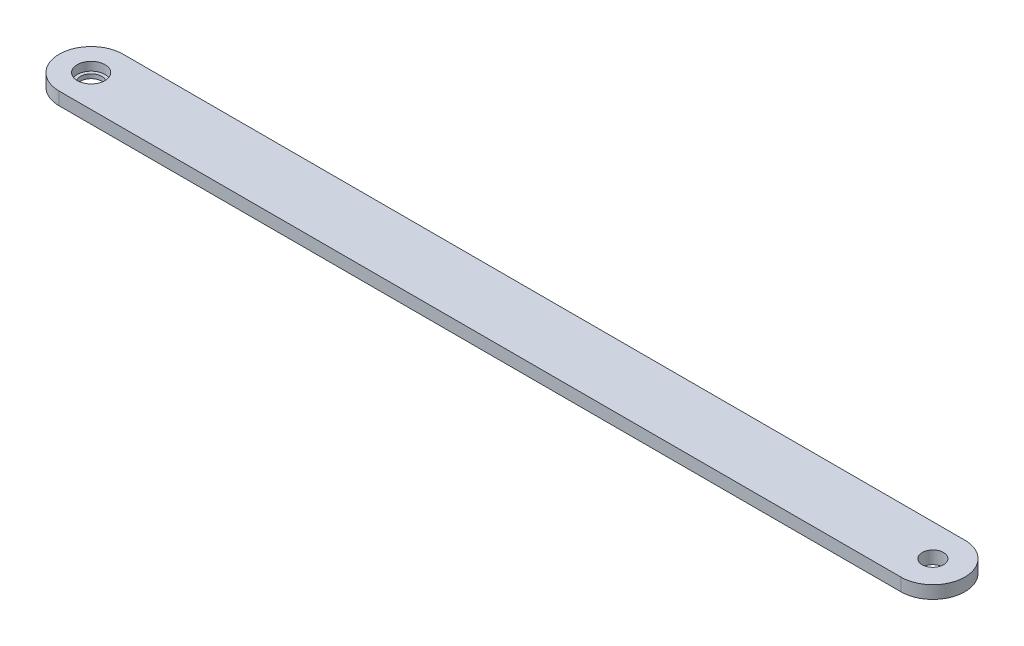
ISO-10303-21;
HEADER;
FILE_DESCRIPTION(('STEP AP214'),'2;1');
FILE_NAME('part.step','',(''),(''),'','','');
FILE_SCHEMA(('AUTOMOTIVE_DESIGN { 1 0 10303 214 1 1 1 1 }'));
ENDSEC;
DATA;
#1=APPLICATION_CONTEXT('core data for automotive mechanical design processes');
#2=APPLICATION_PROTOCOL_DEFINITION('international standard','automotive_design',2000,#1);
#3=PRODUCT_CONTEXT('',#1,'mechanical');
#4=PRODUCT('Part','Part','',(#3));
#5=PRODUCT_RELATED_PRODUCT_CATEGORY('part','',(#4));
#6=PRODUCT_DEFINITION_FORMATION('','',#4);
#7=PRODUCT_DEFINITION_CONTEXT('part definition',#1,'design');
#8=PRODUCT_DEFINITION('design','',#6,#7);
#9=PRODUCT_DEFINITION_SHAPE('','',#8);
#10=(LENGTH_UNIT() NAMED_UNIT(*) SI_UNIT(.MILLI.,.METRE.));
#11=(NAMED_UNIT(*) PLANE_ANGLE_UNIT() SI_UNIT($,.RADIAN.));
#12=(NAMED_UNIT(*) SI_UNIT($,.STERADIAN.) SOLID_ANGLE_UNIT());
#13=UNCERTAINTY_MEASURE_WITH_UNIT(LENGTH_MEASURE(1.E-05),#10,'distance_accuracy_value','');
#14=(GEOMETRIC_REPRESENTATION_CONTEXT(3) GLOBAL_UNCERTAINTY_ASSIGNED_CONTEXT((#13)) GLOBAL_UNIT_ASSIGNED_CONTEXT((#10,
#11,#12)) REPRESENTATION_CONTEXT('',''));
#15=CARTESIAN_POINT('',(0.,0.,0.));
#16=DIRECTION('',(0.,0.,1.));
#17=DIRECTION('',(1.,0.,0.));
#18=AXIS2_PLACEMENT_3D('',#15,#16,#17);
#19=CARTESIAN_POINT('',(-45.,6.,0.));
#20=DIRECTION('',(0.,-1.,0.));
#21=DIRECTION('',(0.,0.,-1.));
#22=AXIS2_PLACEMENT_3D('',#19,#20,#21);
#23=CYLINDRICAL_SURFACE('',#22,5.);
#24=CARTESIAN_POINT('',(-45.,0.,0.));
#25=DIRECTION('',(0.,1.,0.));
#26=DIRECTION('',(0.,0.,1.));
#27=AXIS2_PLACEMENT_3D('',#24,#25,#26);
#28=CIRCLE('',#27,5.);
#29=CARTESIAN_POINT('',(-45.,0.,5.));
#30=VERTEX_POINT('',#29);
#31=EDGE_CURVE('E104',#30,#30,#28,.T.);
#32=ORIENTED_EDGE('',*,*,#31,.F.);
#33=EDGE_LOOP('',(#32));
#34=FACE_BOUND('',#33,.T.);
#35=CARTESIAN_POINT('',(-45.,2.,0.));
#36=DIRECTION('',(0.,1.,0.));
#37=DIRECTION('',(0.,0.,1.));
#38=AXIS2_PLACEMENT_3D('',#35,#36,#37);
#39=CIRCLE('',#38,5.);
#40=CARTESIAN_POINT('',(-45.,2.,5.));
#41=VERTEX_POINT('',#40);
#42=EDGE_CURVE('E38',#41,#41,#39,.T.);
#43=ORIENTED_EDGE('',*,*,#42,.T.);
#44=EDGE_LOOP('',(#43));
#45=FACE_BOUND('',#44,.T.);
#46=ADVANCED_FACE('F34',(#34,#45),#23,.F.);
#47=CARTESIAN_POINT('',(350.,6.,0.));
#48=DIRECTION('',(0.,1.,0.));
#49=DIRECTION('',(0.,0.,1.));
#50=AXIS2_PLACEMENT_3D('',#47,#48,#49);
#51=PLANE('',#50);
#52=CARTESIAN_POINT('',(-45.,6.,0.));
#53=DIRECTION('',(0.,1.,0.));
#54=DIRECTION('',(0.,0.,1.));
#55=AXIS2_PLACEMENT_3D('',#52,#53,#54);
#56=CIRCLE('',#55,6.5);
#57=CARTESIAN_POINT('',(-45.,6.,6.5));
#58=VERTEX_POINT('',#57);
#59=EDGE_CURVE('E124',#58,#58,#56,.T.);
#60=ORIENTED_EDGE('',*,*,#59,.F.);
#61=EDGE_LOOP('',(#60));
#62=FACE_BOUND('',#61,.T.);
#63=CARTESIAN_POINT('',(350.,6.,0.));
#64=DIRECTION('',(0.,1.,0.));
#65=DIRECTION('',(0.,0.,1.));
#66=AXIS2_PLACEMENT_3D('',#63,#64,#65);
#67=CIRCLE('',#66,15.);
#68=CARTESIAN_POINT('',(350.,6.,15.));
#69=VERTEX_POINT('',#68);
#70=CARTESIAN_POINT('',(350.,6.,-15.));
#71=VERTEX_POINT('',#70);
#72=EDGE_CURVE('E88',#69,#71,#67,.T.);
#73=ORIENTED_EDGE('',*,*,#72,.T.);
#74=DIRECTION('',(-1.,0.,0.));
#75=VECTOR('',#74,1.);
#76=CARTESIAN_POINT('',(-45.,6.,-15.));
#77=LINE('',#76,#75);
#78=CARTESIAN_POINT('',(-45.,6.,-15.));
#79=VERTEX_POINT('',#78);
#80=EDGE_CURVE('E82',#71,#79,#77,.T.);
#81=ORIENTED_EDGE('',*,*,#80,.T.);
#82=CARTESIAN_POINT('',(-45.,6.,0.));
#83=DIRECTION('',(0.,1.,0.));
#84=DIRECTION('',(0.,0.,1.));
#85=AXIS2_PLACEMENT_3D('',#82,#83,#84);
#86=CIRCLE('',#85,15.);
#87=CARTESIAN_POINT('',(-45.,6.,15.));
#88=VERTEX_POINT('',#87);
#89=EDGE_CURVE('E86',#79,#88,#86,.T.);
#90=ORIENTED_EDGE('',*,*,#89,.T.);
#91=DIRECTION('',(1.,0.,0.));
#92=VECTOR('',#91,1.);
#93=CARTESIAN_POINT('',(-45.,6.,15.));
#94=LINE('',#93,#92);
#95=EDGE_CURVE('E52',#88,#69,#94,.T.);
#96=ORIENTED_EDGE('',*,*,#95,.T.);
#97=EDGE_LOOP('',(#73,#81,#90,#96));
#98=FACE_BOUND('',#97,.T.);
#99=CARTESIAN_POINT('',(350.,6.,0.));
#100=DIRECTION('',(0.,1.,0.));
#101=DIRECTION('',(0.,0.,1.));
#102=AXIS2_PLACEMENT_3D('',#99,#100,#101);
#103=CIRCLE('',#102,4.99999999999999);
#104=CARTESIAN_POINT('',(350.,6.,4.99999999999999));
#105=VERTEX_POINT('',#104);
#106=EDGE_CURVE('E118',#105,#105,#103,.T.);
#107=ORIENTED_EDGE('',*,*,#106,.F.);
#108=EDGE_LOOP('',(#107));
#109=FACE_BOUND('',#108,.T.);
#110=ADVANCED_FACE('F83',(#62,#98,#109),#51,.T.);
#111=CARTESIAN_POINT('',(350.,0.,0.));
#112=DIRECTION('',(0.,1.,0.));
#113=DIRECTION('',(0.,0.,1.));
#114=AXIS2_PLACEMENT_3D('',#111,#112,#113);
#115=PLANE('',#114);
#116=CARTESIAN_POINT('',(350.,0.,0.));
#117=DIRECTION('',(0.,1.,0.));
#118=DIRECTION('',(0.,0.,1.));
#119=AXIS2_PLACEMENT_3D('',#116,#117,#118);
#120=CIRCLE('',#119,15.);
#121=CARTESIAN_POINT('',(350.,0.,15.));
#122=VERTEX_POINT('',#121);
#123=CARTESIAN_POINT('',(350.,0.,-15.));
#124=VERTEX_POINT('',#123);
#125=EDGE_CURVE('E101',#122,#124,#120,.T.);
#126=ORIENTED_EDGE('',*,*,#125,.F.);
#127=DIRECTION('',(1.,0.,0.));
#128=VECTOR('',#127,1.);
#129=CARTESIAN_POINT('',(-45.,0.,15.));
#130=LINE('',#129,#128);
#131=CARTESIAN_POINT('',(-45.,0.,15.));
#132=VERTEX_POINT('',#131);
#133=EDGE_CURVE('E75',#132,#122,#130,.T.);
#134=ORIENTED_EDGE('',*,*,#133,.F.);
#135=CARTESIAN_POINT('',(-45.,0.,0.));
#136=DIRECTION('',(0.,1.,0.));
#137=DIRECTION('',(0.,0.,1.));
#138=AXIS2_PLACEMENT_3D('',#135,#136,#137);
#139=CIRCLE('',#138,15.);
#140=CARTESIAN_POINT('',(-45.,0.,-15.));
#141=VERTEX_POINT('',#140);
#142=EDGE_CURVE('E69',#141,#132,#139,.T.);
#143=ORIENTED_EDGE('',*,*,#142,.F.);
#144=DIRECTION('',(-1.,0.,0.));
#145=VECTOR('',#144,1.);
#146=CARTESIAN_POINT('',(-45.,0.,-15.));
#147=LINE('',#146,#145);
#148=EDGE_CURVE('E92',#124,#141,#147,.T.);
#149=ORIENTED_EDGE('',*,*,#148,.F.);
#150=EDGE_LOOP('',(#126,#134,#143,#149));
#151=FACE_BOUND('',#150,.T.);
#152=ORIENTED_EDGE('',*,*,#31,.T.);
#153=EDGE_LOOP('',(#152));
#154=FACE_BOUND('',#153,.T.);
#155=CARTESIAN_POINT('',(350.,0.,0.));
#156=DIRECTION('',(0.,1.,0.));
#157=DIRECTION('',(0.,0.,1.));
#158=AXIS2_PLACEMENT_3D('',#155,#156,#157);
#159=CIRCLE('',#158,4.99999999999999);
#160=CARTESIAN_POINT('',(350.,0.,4.99999999999999));
#161=VERTEX_POINT('',#160);
#162=EDGE_CURVE('E119',#161,#161,#159,.T.);
#163=ORIENTED_EDGE('',*,*,#162,.T.);
#164=EDGE_LOOP('',(#163));
#165=FACE_BOUND('',#164,.T.);
#166=ADVANCED_FACE('F112',(#151,#154,#165),#115,.F.);
#167=CARTESIAN_POINT('',(350.,6.,0.));
#168=DIRECTION('',(0.,-1.,0.));
#169=DIRECTION('',(0.,0.,-1.));
#170=AXIS2_PLACEMENT_3D('',#167,#168,#169);
#171=CYLINDRICAL_SURFACE('',#170,15.);
#172=ORIENTED_EDGE('',*,*,#125,.T.);
#173=DIRECTION('',(0.,-1.,0.));
#174=VECTOR('',#173,1.);
#175=CARTESIAN_POINT('',(350.,6.,-15.));
#176=LINE('',#175,#174);
#177=EDGE_CURVE('E11',#71,#124,#176,.T.);
#178=ORIENTED_EDGE('',*,*,#177,.F.);
#179=ORIENTED_EDGE('',*,*,#72,.F.);
#180=DIRECTION('',(0.,-1.,0.));
#181=VECTOR('',#180,1.);
#182=CARTESIAN_POINT('',(350.,6.,15.));
#183=LINE('',#182,#181);
#184=EDGE_CURVE('E97',#69,#122,#183,.T.);
#185=ORIENTED_EDGE('',*,*,#184,.T.);
#186=EDGE_LOOP('',(#172,#178,#179,#185));
#187=FACE_BOUND('',#186,.T.);
#188=ADVANCED_FACE('F36',(#187),#171,.T.);
#189=CARTESIAN_POINT('',(-45.,6.,-15.));
#190=DIRECTION('',(0.,0.,1.));
#191=DIRECTION('',(1.,0.,0.));
#192=AXIS2_PLACEMENT_3D('',#189,#190,#191);
#193=PLANE('',#192);
#194=ORIENTED_EDGE('',*,*,#148,.T.);
#195=DIRECTION('',(0.,-1.,0.));
#196=VECTOR('',#195,1.);
#197=CARTESIAN_POINT('',(-45.,6.,-15.));
#198=LINE('',#197,#196);
#199=EDGE_CURVE('E44',#79,#141,#198,.T.);
#200=ORIENTED_EDGE('',*,*,#199,.F.);
#201=ORIENTED_EDGE('',*,*,#80,.F.);
#202=ORIENTED_EDGE('',*,*,#177,.T.);
#203=EDGE_LOOP('',(#194,#200,#201,#202));
#204=FACE_BOUND('',#203,.T.);
#205=ADVANCED_FACE('F91',(#204),#193,.F.);
#206=CARTESIAN_POINT('',(-45.,6.,0.));
#207=DIRECTION('',(0.,-1.,0.));
#208=DIRECTION('',(0.,0.,-1.));
#209=AXIS2_PLACEMENT_3D('',#206,#207,#208);
#210=CYLINDRICAL_SURFACE('',#209,15.);
#211=ORIENTED_EDGE('',*,*,#142,.T.);
#212=DIRECTION('',(0.,-1.,0.));
#213=VECTOR('',#212,1.);
#214=CARTESIAN_POINT('',(-45.,6.,15.));
#215=LINE('',#214,#213);
#216=EDGE_CURVE('E93',#88,#132,#215,.T.);
#217=ORIENTED_EDGE('',*,*,#216,.F.);
#218=ORIENTED_EDGE('',*,*,#89,.F.);
#219=ORIENTED_EDGE('',*,*,#199,.T.);
#220=EDGE_LOOP('',(#211,#217,#218,#219));
#221=FACE_BOUND('',#220,.T.);
#222=ADVANCED_FACE('F95',(#221),#210,.T.);
#223=CARTESIAN_POINT('',(-45.,6.,15.));
#224=DIRECTION('',(0.,0.,-1.));
#225=DIRECTION('',(-1.,0.,0.));
#226=AXIS2_PLACEMENT_3D('',#223,#224,#225);
#227=PLANE('',#226);
#228=ORIENTED_EDGE('',*,*,#133,.T.);
#229=ORIENTED_EDGE('',*,*,#184,.F.);
#230=ORIENTED_EDGE('',*,*,#95,.F.);
#231=ORIENTED_EDGE('',*,*,#216,.T.);
#232=EDGE_LOOP('',(#228,#229,#230,#231));
#233=FACE_BOUND('',#232,.T.);
#234=ADVANCED_FACE('F109',(#233),#227,.F.);
#235=CARTESIAN_POINT('',(350.,6.,0.));
#236=DIRECTION('',(0.,-1.,0.));
#237=DIRECTION('',(0.,0.,-1.));
#238=AXIS2_PLACEMENT_3D('',#235,#236,#237);
#239=CYLINDRICAL_SURFACE('',#238,4.99999999999999);
#240=ORIENTED_EDGE('',*,*,#106,.T.);
#241=EDGE_LOOP('',(#240));
#242=FACE_BOUND('',#241,.T.);
#243=ORIENTED_EDGE('',*,*,#162,.F.);
#244=EDGE_LOOP('',(#243));
#245=FACE_BOUND('',#244,.T.);
#246=ADVANCED_FACE('F142',(#242,#245),#239,.F.);
#247=CARTESIAN_POINT('',(-45.,2.,0.));
#248=DIRECTION('',(0.,1.,0.));
#249=DIRECTION('',(0.,0.,1.));
#250=AXIS2_PLACEMENT_3D('',#247,#248,#249);
#251=CYLINDRICAL_SURFACE('',#250,6.5);
#252=CARTESIAN_POINT('',(-45.,2.,0.));
#253=DIRECTION('',(0.,1.,0.));
#254=DIRECTION('',(0.,0.,1.));
#255=AXIS2_PLACEMENT_3D('',#252,#253,#254);
#256=CIRCLE('',#255,6.5);
#257=CARTESIAN_POINT('',(-45.,2.,6.5));
#258=VERTEX_POINT('',#257);
#259=EDGE_CURVE('E127',#258,#258,#256,.T.);
#260=ORIENTED_EDGE('',*,*,#259,.F.);
#261=EDGE_LOOP('',(#260));
#262=FACE_BOUND('',#261,.T.);
#263=ORIENTED_EDGE('',*,*,#59,.T.);
#264=EDGE_LOOP('',(#263));
#265=FACE_BOUND('',#264,.T.);
#266=ADVANCED_FACE('F137',(#262,#265),#251,.F.);
#267=CARTESIAN_POINT('',(-45.,2.,0.));
#268=DIRECTION('',(0.,1.,0.));
#269=DIRECTION('',(0.,0.,1.));
#270=AXIS2_PLACEMENT_3D('',#267,#268,#269);
#271=PLANE('',#270);
#272=ORIENTED_EDGE('',*,*,#42,.F.);
#273=EDGE_LOOP('',(#272));
#274=FACE_BOUND('',#273,.T.);
#275=ORIENTED_EDGE('',*,*,#259,.T.);
#276=EDGE_LOOP('',(#275));
#277=FACE_BOUND('',#276,.T.);
#278=ADVANCED_FACE('F135',(#274,#277),#271,.T.);
#279=CLOSED_SHELL('',(#46,#110,#166,#188,#205,#222,#234,#246,#266,#278));
#280=MANIFOLD_SOLID_BREP('B2',#279);
#281=ADVANCED_BREP_SHAPE_REPRESENTATION('',(#18,#280),#14);
#282=SHAPE_DEFINITION_REPRESENTATION(#9,#281);
ENDSEC;
END-ISO-10303-21;
